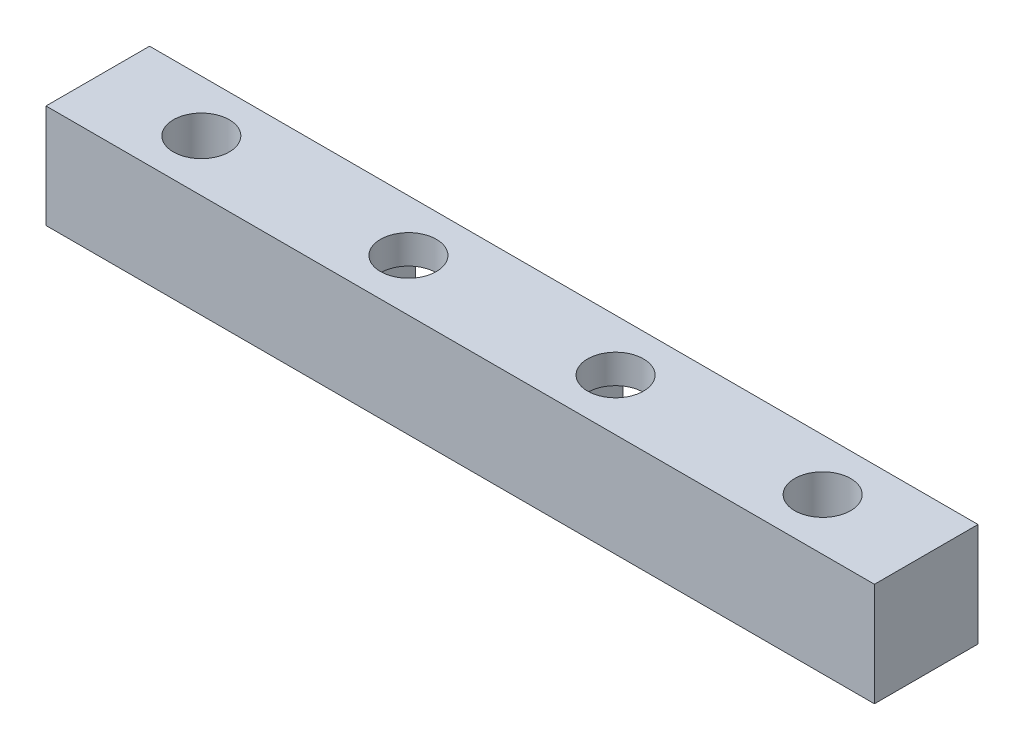
ISO-10303-21;
HEADER;
FILE_DESCRIPTION(('STEP AP214'),'2;1');
FILE_NAME('part.step','',(''),(''),'','','');
FILE_SCHEMA(('AUTOMOTIVE_DESIGN { 1 0 10303 214 1 1 1 1 }'));
ENDSEC;
DATA;
#1=APPLICATION_CONTEXT('core data for automotive mechanical design processes');
#2=APPLICATION_PROTOCOL_DEFINITION('international standard','automotive_design',2000,#1);
#3=PRODUCT_CONTEXT('',#1,'mechanical');
#4=PRODUCT('Part','Part','',(#3));
#5=PRODUCT_RELATED_PRODUCT_CATEGORY('part','',(#4));
#6=PRODUCT_DEFINITION_FORMATION('','',#4);
#7=PRODUCT_DEFINITION_CONTEXT('part definition',#1,'design');
#8=PRODUCT_DEFINITION('design','',#6,#7);
#9=PRODUCT_DEFINITION_SHAPE('','',#8);
#10=(LENGTH_UNIT() NAMED_UNIT(*) SI_UNIT(.MILLI.,.METRE.));
#11=(NAMED_UNIT(*) PLANE_ANGLE_UNIT() SI_UNIT($,.RADIAN.));
#12=(NAMED_UNIT(*) SI_UNIT($,.STERADIAN.) SOLID_ANGLE_UNIT());
#13=UNCERTAINTY_MEASURE_WITH_UNIT(LENGTH_MEASURE(1.E-05),#10,'distance_accuracy_value','');
#14=(GEOMETRIC_REPRESENTATION_CONTEXT(3) GLOBAL_UNCERTAINTY_ASSIGNED_CONTEXT((#13)) GLOBAL_UNIT_ASSIGNED_CONTEXT((#10,
#11,#12)) REPRESENTATION_CONTEXT('',''));
#15=CARTESIAN_POINT('',(0.,0.,0.));
#16=DIRECTION('',(0.,0.,1.));
#17=DIRECTION('',(1.,0.,0.));
#18=AXIS2_PLACEMENT_3D('',#15,#16,#17);
#19=CARTESIAN_POINT('',(-50.8,12.7,-12.7));
#20=DIRECTION('',(0.,0.,1.));
#21=DIRECTION('',(1.,0.,0.));
#22=AXIS2_PLACEMENT_3D('',#19,#20,#21);
#23=PLANE('',#22);
#24=DIRECTION('',(-1.,0.,0.));
#25=VECTOR('',#24,1.);
#26=CARTESIAN_POINT('',(-50.8,3.556,-12.7));
#27=LINE('',#26,#25);
#28=CARTESIAN_POINT('',(-7.23900000000001,3.556,-12.7));
#29=VERTEX_POINT('',#28);
#30=CARTESIAN_POINT('',(-18.161,3.556,-12.7));
#31=VERTEX_POINT('',#30);
#32=EDGE_CURVE('E216',#29,#31,#27,.T.);
#33=ORIENTED_EDGE('',*,*,#32,.F.);
#34=DIRECTION('',(0.,1.,0.));
#35=VECTOR('',#34,1.);
#36=CARTESIAN_POINT('',(-7.23900000000002,12.7,-12.7));
#37=LINE('',#36,#35);
#38=CARTESIAN_POINT('',(-7.23900000000001,9.144,-12.7));
#39=VERTEX_POINT('',#38);
#40=EDGE_CURVE('E272',#29,#39,#37,.T.);
#41=ORIENTED_EDGE('',*,*,#40,.T.);
#42=DIRECTION('',(-1.,0.,0.));
#43=VECTOR('',#42,1.);
#44=CARTESIAN_POINT('',(-50.8,9.144,-12.7));
#45=LINE('',#44,#43);
#46=CARTESIAN_POINT('',(-18.161,9.144,-12.7));
#47=VERTEX_POINT('',#46);
#48=EDGE_CURVE('E212',#39,#47,#45,.T.);
#49=ORIENTED_EDGE('',*,*,#48,.T.);
#50=DIRECTION('',(0.,-1.,0.));
#51=VECTOR('',#50,1.);
#52=CARTESIAN_POINT('',(-18.161,12.7,-12.7));
#53=LINE('',#52,#51);
#54=EDGE_CURVE('E279',#47,#31,#53,.T.);
#55=ORIENTED_EDGE('',*,*,#54,.T.);
#56=EDGE_LOOP('',(#33,#41,#49,#55));
#57=FACE_BOUND('',#56,.T.);
#58=DIRECTION('',(-1.,0.,0.));
#59=VECTOR('',#58,1.);
#60=CARTESIAN_POINT('',(-50.8,0.,-12.7));
#61=LINE('',#60,#59);
#62=CARTESIAN_POINT('',(50.8,0.,-12.7));
#63=VERTEX_POINT('',#62);
#64=CARTESIAN_POINT('',(-50.8,0.,-12.7));
#65=VERTEX_POINT('',#64);
#66=EDGE_CURVE('E247',#63,#65,#61,.T.);
#67=ORIENTED_EDGE('',*,*,#66,.T.);
#68=DIRECTION('',(0.,-1.,0.));
#69=VECTOR('',#68,1.);
#70=CARTESIAN_POINT('',(-50.8,12.7,-12.7));
#71=LINE('',#70,#69);
#72=CARTESIAN_POINT('',(-50.8,12.7,-12.7));
#73=VERTEX_POINT('',#72);
#74=EDGE_CURVE('E253',#73,#65,#71,.T.);
#75=ORIENTED_EDGE('',*,*,#74,.F.);
#76=DIRECTION('',(-1.,0.,0.));
#77=VECTOR('',#76,1.);
#78=CARTESIAN_POINT('',(-50.8,12.7,-12.7));
#79=LINE('',#78,#77);
#80=CARTESIAN_POINT('',(50.8,12.7,-12.7));
#81=VERTEX_POINT('',#80);
#82=EDGE_CURVE('E251',#81,#73,#79,.T.);
#83=ORIENTED_EDGE('',*,*,#82,.F.);
#84=DIRECTION('',(0.,-1.,0.));
#85=VECTOR('',#84,1.);
#86=CARTESIAN_POINT('',(50.8,12.7,-12.7));
#87=LINE('',#86,#85);
#88=EDGE_CURVE('E263',#81,#63,#87,.T.);
#89=ORIENTED_EDGE('',*,*,#88,.T.);
#90=EDGE_LOOP('',(#67,#75,#83,#89));
#91=FACE_BOUND('',#90,.T.);
#92=DIRECTION('',(-1.,0.,0.));
#93=VECTOR('',#92,1.);
#94=CARTESIAN_POINT('',(-50.8,3.556,-12.7));
#95=LINE('',#94,#93);
#96=CARTESIAN_POINT('',(18.161,3.556,-12.7));
#97=VERTEX_POINT('',#96);
#98=CARTESIAN_POINT('',(7.23899999999999,3.556,-12.7));
#99=VERTEX_POINT('',#98);
#100=EDGE_CURVE('E180',#97,#99,#95,.T.);
#101=ORIENTED_EDGE('',*,*,#100,.F.);
#102=DIRECTION('',(0.,1.,0.));
#103=VECTOR('',#102,1.);
#104=CARTESIAN_POINT('',(18.161,12.7,-12.7));
#105=LINE('',#104,#103);
#106=CARTESIAN_POINT('',(18.161,9.144,-12.7));
#107=VERTEX_POINT('',#106);
#108=EDGE_CURVE('E43',#97,#107,#105,.T.);
#109=ORIENTED_EDGE('',*,*,#108,.T.);
#110=DIRECTION('',(-1.,0.,0.));
#111=VECTOR('',#110,1.);
#112=CARTESIAN_POINT('',(-50.8,9.144,-12.7));
#113=LINE('',#112,#111);
#114=CARTESIAN_POINT('',(7.23899999999999,9.144,-12.7));
#115=VERTEX_POINT('',#114);
#116=EDGE_CURVE('E176',#107,#115,#113,.T.);
#117=ORIENTED_EDGE('',*,*,#116,.T.);
#118=DIRECTION('',(0.,-1.,0.));
#119=VECTOR('',#118,1.);
#120=CARTESIAN_POINT('',(7.23899999999999,12.7,-12.7));
#121=LINE('',#120,#119);
#122=EDGE_CURVE('E11',#115,#99,#121,.T.);
#123=ORIENTED_EDGE('',*,*,#122,.T.);
#124=EDGE_LOOP('',(#101,#109,#117,#123));
#125=FACE_BOUND('',#124,.T.);
#126=ADVANCED_FACE('F35',(#57,#91,#125),#23,.F.);
#127=CARTESIAN_POINT('',(12.7,0.,-6.34999999999998));
#128=DIRECTION('',(0.,1.,0.));
#129=DIRECTION('',(0.,0.,1.));
#130=AXIS2_PLACEMENT_3D('',#127,#128,#129);
#131=CYLINDRICAL_SURFACE('',#130,3.429);
#132=CARTESIAN_POINT('',(12.7,0.,-6.34999999999998));
#133=DIRECTION('',(0.,1.,0.));
#134=DIRECTION('',(0.,0.,1.));
#135=AXIS2_PLACEMENT_3D('',#132,#133,#134);
#136=CIRCLE('',#135,3.429);
#137=CARTESIAN_POINT('',(12.7,0.,-2.92099999999998));
#138=VERTEX_POINT('',#137);
#139=EDGE_CURVE('E232',#138,#138,#136,.T.);
#140=ORIENTED_EDGE('',*,*,#139,.F.);
#141=EDGE_LOOP('',(#140));
#142=FACE_BOUND('',#141,.T.);
#143=CARTESIAN_POINT('',(12.7,3.556,-6.34999999999998));
#144=DIRECTION('',(0.,1.,0.));
#145=DIRECTION('',(0.,0.,1.));
#146=AXIS2_PLACEMENT_3D('',#143,#144,#145);
#147=CIRCLE('',#146,3.429);
#148=CARTESIAN_POINT('',(12.7,3.556,-2.92099999999998));
#149=VERTEX_POINT('',#148);
#150=EDGE_CURVE('E179',#149,#149,#147,.F.);
#151=ORIENTED_EDGE('',*,*,#150,.F.);
#152=EDGE_LOOP('',(#151));
#153=FACE_BOUND('',#152,.T.);
#154=ADVANCED_FACE('F306',(#142,#153),#131,.F.);
#155=CARTESIAN_POINT('',(-12.7,0.,-6.34999999999998));
#156=DIRECTION('',(0.,1.,0.));
#157=DIRECTION('',(0.,0.,1.));
#158=AXIS2_PLACEMENT_3D('',#155,#156,#157);
#159=CYLINDRICAL_SURFACE('',#158,3.429);
#160=CARTESIAN_POINT('',(-12.7,0.,-6.34999999999998));
#161=DIRECTION('',(0.,1.,0.));
#162=DIRECTION('',(0.,0.,1.));
#163=AXIS2_PLACEMENT_3D('',#160,#161,#162);
#164=CIRCLE('',#163,3.429);
#165=CARTESIAN_POINT('',(-12.7,0.,-2.92099999999998));
#166=VERTEX_POINT('',#165);
#167=EDGE_CURVE('E226',#166,#166,#164,.T.);
#168=ORIENTED_EDGE('',*,*,#167,.F.);
#169=EDGE_LOOP('',(#168));
#170=FACE_BOUND('',#169,.T.);
#171=CARTESIAN_POINT('',(-12.7,3.556,-6.34999999999998));
#172=DIRECTION('',(0.,1.,0.));
#173=DIRECTION('',(0.,0.,1.));
#174=AXIS2_PLACEMENT_3D('',#171,#172,#173);
#175=CIRCLE('',#174,3.429);
#176=CARTESIAN_POINT('',(-12.7,3.556,-2.92099999999998));
#177=VERTEX_POINT('',#176);
#178=EDGE_CURVE('E215',#177,#177,#175,.F.);
#179=ORIENTED_EDGE('',*,*,#178,.F.);
#180=EDGE_LOOP('',(#179));
#181=FACE_BOUND('',#180,.T.);
#182=ADVANCED_FACE('F312',(#170,#181),#159,.F.);
#183=CARTESIAN_POINT('',(-50.8,12.7,-12.7));
#184=DIRECTION('',(1.,0.,0.));
#185=DIRECTION('',(0.,0.,-1.));
#186=AXIS2_PLACEMENT_3D('',#183,#184,#185);
#187=PLANE('',#186);
#188=DIRECTION('',(0.,0.,1.));
#189=VECTOR('',#188,1.);
#190=CARTESIAN_POINT('',(-50.8,0.,-12.7));
#191=LINE('',#190,#189);
#192=CARTESIAN_POINT('',(-50.8,0.,0.));
#193=VERTEX_POINT('',#192);
#194=EDGE_CURVE('E240',#65,#193,#191,.T.);
#195=ORIENTED_EDGE('',*,*,#194,.T.);
#196=DIRECTION('',(0.,-1.,0.));
#197=VECTOR('',#196,1.);
#198=CARTESIAN_POINT('',(-50.8,12.7,0.));
#199=LINE('',#198,#197);
#200=CARTESIAN_POINT('',(-50.8,12.7,0.));
#201=VERTEX_POINT('',#200);
#202=EDGE_CURVE('E269',#201,#193,#199,.T.);
#203=ORIENTED_EDGE('',*,*,#202,.F.);
#204=DIRECTION('',(0.,0.,1.));
#205=VECTOR('',#204,1.);
#206=CARTESIAN_POINT('',(-50.8,12.7,-12.7));
#207=LINE('',#206,#205);
#208=EDGE_CURVE('E243',#73,#201,#207,.T.);
#209=ORIENTED_EDGE('',*,*,#208,.F.);
#210=ORIENTED_EDGE('',*,*,#74,.T.);
#211=EDGE_LOOP('',(#195,#203,#209,#210));
#212=FACE_BOUND('',#211,.T.);
#213=ADVANCED_FACE('F37',(#212),#187,.F.);
#214=CARTESIAN_POINT('',(-50.8,12.7,0.));
#215=DIRECTION('',(0.,0.,-1.));
#216=DIRECTION('',(-1.,0.,0.));
#217=AXIS2_PLACEMENT_3D('',#214,#215,#216);
#218=PLANE('',#217);
#219=DIRECTION('',(1.,0.,0.));
#220=VECTOR('',#219,1.);
#221=CARTESIAN_POINT('',(-50.8,0.,0.));
#222=LINE('',#221,#220);
#223=CARTESIAN_POINT('',(50.8,0.,0.));
#224=VERTEX_POINT('',#223);
#225=EDGE_CURVE('E256',#193,#224,#222,.T.);
#226=ORIENTED_EDGE('',*,*,#225,.T.);
#227=DIRECTION('',(0.,-1.,0.));
#228=VECTOR('',#227,1.);
#229=CARTESIAN_POINT('',(50.8,12.7,0.));
#230=LINE('',#229,#228);
#231=CARTESIAN_POINT('',(50.8,12.7,0.));
#232=VERTEX_POINT('',#231);
#233=EDGE_CURVE('E266',#232,#224,#230,.T.);
#234=ORIENTED_EDGE('',*,*,#233,.F.);
#235=DIRECTION('',(1.,0.,0.));
#236=VECTOR('',#235,1.);
#237=CARTESIAN_POINT('',(-50.8,12.7,0.));
#238=LINE('',#237,#236);
#239=EDGE_CURVE('E246',#201,#232,#238,.T.);
#240=ORIENTED_EDGE('',*,*,#239,.F.);
#241=ORIENTED_EDGE('',*,*,#202,.T.);
#242=EDGE_LOOP('',(#226,#234,#240,#241));
#243=FACE_BOUND('',#242,.T.);
#244=ADVANCED_FACE('F325',(#243),#218,.F.);
#245=CARTESIAN_POINT('',(50.8,12.7,-12.7));
#246=DIRECTION('',(-1.,0.,0.));
#247=DIRECTION('',(0.,0.,1.));
#248=AXIS2_PLACEMENT_3D('',#245,#246,#247);
#249=PLANE('',#248);
#250=DIRECTION('',(0.,0.,-1.));
#251=VECTOR('',#250,1.);
#252=CARTESIAN_POINT('',(50.8,0.,-12.7));
#253=LINE('',#252,#251);
#254=EDGE_CURVE('E258',#224,#63,#253,.T.);
#255=ORIENTED_EDGE('',*,*,#254,.T.);
#256=ORIENTED_EDGE('',*,*,#88,.F.);
#257=DIRECTION('',(0.,0.,-1.));
#258=VECTOR('',#257,1.);
#259=CARTESIAN_POINT('',(50.8,12.7,-12.7));
#260=LINE('',#259,#258);
#261=EDGE_CURVE('E249',#232,#81,#260,.T.);
#262=ORIENTED_EDGE('',*,*,#261,.F.);
#263=ORIENTED_EDGE('',*,*,#233,.T.);
#264=EDGE_LOOP('',(#255,#256,#262,#263));
#265=FACE_BOUND('',#264,.T.);
#266=ADVANCED_FACE('F322',(#265),#249,.F.);
#267=CARTESIAN_POINT('',(0.,12.7,0.));
#268=DIRECTION('',(0.,1.,0.));
#269=DIRECTION('',(0.,0.,1.));
#270=AXIS2_PLACEMENT_3D('',#267,#268,#269);
#271=PLANE('',#270);
#272=CARTESIAN_POINT('',(38.1,12.7,-6.34999999999998));
#273=DIRECTION('',(0.,1.,0.));
#274=DIRECTION('',(0.,0.,1.));
#275=AXIS2_PLACEMENT_3D('',#272,#273,#274);
#276=CIRCLE('',#275,3.429);
#277=CARTESIAN_POINT('',(38.1,12.7,-2.92099999999998));
#278=VERTEX_POINT('',#277);
#279=EDGE_CURVE('E223',#278,#278,#276,.T.);
#280=ORIENTED_EDGE('',*,*,#279,.F.);
#281=EDGE_LOOP('',(#280));
#282=FACE_BOUND('',#281,.T.);
#283=CARTESIAN_POINT('',(-12.7,12.7,-6.34999999999998));
#284=DIRECTION('',(0.,1.,0.));
#285=DIRECTION('',(0.,0.,1.));
#286=AXIS2_PLACEMENT_3D('',#283,#284,#285);
#287=CIRCLE('',#286,3.429);
#288=CARTESIAN_POINT('',(-12.7,12.7,-2.92099999999998));
#289=VERTEX_POINT('',#288);
#290=EDGE_CURVE('E229',#289,#289,#287,.T.);
#291=ORIENTED_EDGE('',*,*,#290,.F.);
#292=EDGE_LOOP('',(#291));
#293=FACE_BOUND('',#292,.T.);
#294=CARTESIAN_POINT('',(12.7,12.7,-6.34999999999998));
#295=DIRECTION('',(0.,1.,0.));
#296=DIRECTION('',(0.,0.,1.));
#297=AXIS2_PLACEMENT_3D('',#294,#295,#296);
#298=CIRCLE('',#297,3.429);
#299=CARTESIAN_POINT('',(12.7,12.7,-2.92099999999998));
#300=VERTEX_POINT('',#299);
#301=EDGE_CURVE('E218',#300,#300,#298,.T.);
#302=ORIENTED_EDGE('',*,*,#301,.F.);
#303=EDGE_LOOP('',(#302));
#304=FACE_BOUND('',#303,.T.);
#305=CARTESIAN_POINT('',(-38.1,12.7,-6.34999999999998));
#306=DIRECTION('',(0.,1.,0.));
#307=DIRECTION('',(0.,0.,1.));
#308=AXIS2_PLACEMENT_3D('',#305,#306,#307);
#309=CIRCLE('',#308,3.429);
#310=CARTESIAN_POINT('',(-38.1,12.7,-2.92099999999998));
#311=VERTEX_POINT('',#310);
#312=EDGE_CURVE('E222',#311,#311,#309,.T.);
#313=ORIENTED_EDGE('',*,*,#312,.F.);
#314=EDGE_LOOP('',(#313));
#315=FACE_BOUND('',#314,.T.);
#316=ORIENTED_EDGE('',*,*,#208,.T.);
#317=ORIENTED_EDGE('',*,*,#239,.T.);
#318=ORIENTED_EDGE('',*,*,#261,.T.);
#319=ORIENTED_EDGE('',*,*,#82,.T.);
#320=EDGE_LOOP('',(#316,#317,#318,#319));
#321=FACE_BOUND('',#320,.T.);
#322=ADVANCED_FACE('F324',(#282,#293,#304,#315,#321),#271,.T.);
#323=CARTESIAN_POINT('',(0.,0.,0.));
#324=DIRECTION('',(0.,1.,0.));
#325=DIRECTION('',(0.,0.,1.));
#326=AXIS2_PLACEMENT_3D('',#323,#324,#325);
#327=PLANE('',#326);
#328=CARTESIAN_POINT('',(38.1,0.,-6.34999999999998));
#329=DIRECTION('',(0.,1.,0.));
#330=DIRECTION('',(0.,0.,1.));
#331=AXIS2_PLACEMENT_3D('',#328,#329,#330);
#332=CIRCLE('',#331,3.429);
#333=CARTESIAN_POINT('',(38.1,0.,-2.92099999999998));
#334=VERTEX_POINT('',#333);
#335=EDGE_CURVE('E219',#334,#334,#332,.T.);
#336=ORIENTED_EDGE('',*,*,#335,.T.);
#337=EDGE_LOOP('',(#336));
#338=FACE_BOUND('',#337,.T.);
#339=ORIENTED_EDGE('',*,*,#167,.T.);
#340=EDGE_LOOP('',(#339));
#341=FACE_BOUND('',#340,.T.);
#342=ORIENTED_EDGE('',*,*,#139,.T.);
#343=EDGE_LOOP('',(#342));
#344=FACE_BOUND('',#343,.T.);
#345=CARTESIAN_POINT('',(-38.1,0.,-6.34999999999998));
#346=DIRECTION('',(0.,1.,0.));
#347=DIRECTION('',(0.,0.,1.));
#348=AXIS2_PLACEMENT_3D('',#345,#346,#347);
#349=CIRCLE('',#348,3.429);
#350=CARTESIAN_POINT('',(-38.1,0.,-2.92099999999998));
#351=VERTEX_POINT('',#350);
#352=EDGE_CURVE('E237',#351,#351,#349,.T.);
#353=ORIENTED_EDGE('',*,*,#352,.T.);
#354=EDGE_LOOP('',(#353));
#355=FACE_BOUND('',#354,.T.);
#356=ORIENTED_EDGE('',*,*,#194,.F.);
#357=ORIENTED_EDGE('',*,*,#66,.F.);
#358=ORIENTED_EDGE('',*,*,#254,.F.);
#359=ORIENTED_EDGE('',*,*,#225,.F.);
#360=EDGE_LOOP('',(#356,#357,#358,#359));
#361=FACE_BOUND('',#360,.T.);
#362=ADVANCED_FACE('F320',(#338,#341,#344,#355,#361),#327,.F.);
#363=CARTESIAN_POINT('',(-38.1,0.,-6.34999999999998));
#364=DIRECTION('',(0.,1.,0.));
#365=DIRECTION('',(0.,0.,1.));
#366=AXIS2_PLACEMENT_3D('',#363,#364,#365);
#367=CYLINDRICAL_SURFACE('',#366,3.429);
#368=ORIENTED_EDGE('',*,*,#352,.F.);
#369=EDGE_LOOP('',(#368));
#370=FACE_BOUND('',#369,.T.);
#371=ORIENTED_EDGE('',*,*,#312,.T.);
#372=EDGE_LOOP('',(#371));
#373=FACE_BOUND('',#372,.T.);
#374=ADVANCED_FACE('F350',(#370,#373),#367,.F.);
#375=CARTESIAN_POINT('',(12.7,9.144,-6.34999999999998));
#376=DIRECTION('',(0.,1.,0.));
#377=DIRECTION('',(0.,0.,1.));
#378=AXIS2_PLACEMENT_3D('',#375,#376,#377);
#379=CIRCLE('',#378,3.429);
#380=CARTESIAN_POINT('',(12.7,9.144,-2.92099999999998));
#381=VERTEX_POINT('',#380);
#382=EDGE_CURVE('E174',#381,#381,#379,.F.);
#383=ORIENTED_EDGE('',*,*,#382,.T.);
#384=EDGE_LOOP('',(#383));
#385=FACE_BOUND('',#384,.T.);
#386=ORIENTED_EDGE('',*,*,#301,.T.);
#387=EDGE_LOOP('',(#386));
#388=FACE_BOUND('',#387,.T.);
#389=ADVANCED_FACE('F315',(#385,#388),#131,.F.);
#390=CARTESIAN_POINT('',(-12.7,9.144,-6.34999999999998));
#391=DIRECTION('',(0.,1.,0.));
#392=DIRECTION('',(0.,0.,1.));
#393=AXIS2_PLACEMENT_3D('',#390,#391,#392);
#394=CIRCLE('',#393,3.429);
#395=CARTESIAN_POINT('',(-12.7,9.144,-2.92099999999998));
#396=VERTEX_POINT('',#395);
#397=EDGE_CURVE('E207',#396,#396,#394,.F.);
#398=ORIENTED_EDGE('',*,*,#397,.T.);
#399=EDGE_LOOP('',(#398));
#400=FACE_BOUND('',#399,.T.);
#401=ORIENTED_EDGE('',*,*,#290,.T.);
#402=EDGE_LOOP('',(#401));
#403=FACE_BOUND('',#402,.T.);
#404=ADVANCED_FACE('F359',(#400,#403),#159,.F.);
#405=CARTESIAN_POINT('',(38.1,0.,-6.34999999999998));
#406=DIRECTION('',(0.,1.,0.));
#407=DIRECTION('',(0.,0.,1.));
#408=AXIS2_PLACEMENT_3D('',#405,#406,#407);
#409=CYLINDRICAL_SURFACE('',#408,3.429);
#410=ORIENTED_EDGE('',*,*,#335,.F.);
#411=EDGE_LOOP('',(#410));
#412=FACE_BOUND('',#411,.T.);
#413=ORIENTED_EDGE('',*,*,#279,.T.);
#414=EDGE_LOOP('',(#413));
#415=FACE_BOUND('',#414,.T.);
#416=ADVANCED_FACE('F363',(#412,#415),#409,.F.);
#417=CARTESIAN_POINT('',(-18.161,3.556,-3.19709017995544));
#418=DIRECTION('',(-1.,0.,0.));
#419=DIRECTION('',(0.,0.,1.));
#420=AXIS2_PLACEMENT_3D('',#417,#418,#419);
#421=PLANE('',#420);
#422=DIRECTION('',(0.,0.,1.));
#423=VECTOR('',#422,1.);
#424=CARTESIAN_POINT('',(-18.161,9.144,-3.19709017995544));
#425=LINE('',#424,#423);
#426=CARTESIAN_POINT('',(-18.161,9.144,-3.19709017995544));
#427=VERTEX_POINT('',#426);
#428=EDGE_CURVE('E58',#47,#427,#425,.T.);
#429=ORIENTED_EDGE('',*,*,#428,.T.);
#430=DIRECTION('',(0.,1.,0.));
#431=VECTOR('',#430,1.);
#432=CARTESIAN_POINT('',(-18.161,3.556,-3.19709017995544));
#433=LINE('',#432,#431);
#434=CARTESIAN_POINT('',(-18.161,3.556,-3.19709017995544));
#435=VERTEX_POINT('',#434);
#436=EDGE_CURVE('E204',#435,#427,#433,.T.);
#437=ORIENTED_EDGE('',*,*,#436,.F.);
#438=DIRECTION('',(0.,0.,1.));
#439=VECTOR('',#438,1.);
#440=CARTESIAN_POINT('',(-18.161,3.556,-3.19709017995544));
#441=LINE('',#440,#439);
#442=EDGE_CURVE('E192',#31,#435,#441,.T.);
#443=ORIENTED_EDGE('',*,*,#442,.F.);
#444=ORIENTED_EDGE('',*,*,#54,.F.);
#445=EDGE_LOOP('',(#429,#437,#443,#444));
#446=FACE_BOUND('',#445,.T.);
#447=ADVANCED_FACE('F367',(#446),#421,.F.);
#448=CARTESIAN_POINT('',(-7.23900000000001,3.556,-19.396139052979));
#449=DIRECTION('',(1.,0.,0.));
#450=DIRECTION('',(0.,0.,-1.));
#451=AXIS2_PLACEMENT_3D('',#448,#449,#450);
#452=PLANE('',#451);
#453=DIRECTION('',(0.,0.,-1.));
#454=VECTOR('',#453,1.);
#455=CARTESIAN_POINT('',(-7.23900000000001,3.556,-3.19709017995543));
#456=LINE('',#455,#454);
#457=CARTESIAN_POINT('',(-7.23900000000001,3.556,-3.19709017995543));
#458=VERTEX_POINT('',#457);
#459=EDGE_CURVE('E189',#458,#29,#456,.T.);
#460=ORIENTED_EDGE('',*,*,#459,.F.);
#461=DIRECTION('',(0.,1.,0.));
#462=VECTOR('',#461,1.);
#463=CARTESIAN_POINT('',(-7.23900000000001,3.556,-3.19709017995543));
#464=LINE('',#463,#462);
#465=CARTESIAN_POINT('',(-7.23900000000001,9.144,-3.19709017995543));
#466=VERTEX_POINT('',#465);
#467=EDGE_CURVE('E208',#458,#466,#464,.T.);
#468=ORIENTED_EDGE('',*,*,#467,.T.);
#469=DIRECTION('',(0.,0.,-1.));
#470=VECTOR('',#469,1.);
#471=CARTESIAN_POINT('',(-7.23900000000001,9.144,-19.396139052979));
#472=LINE('',#471,#470);
#473=EDGE_CURVE('E200',#466,#39,#472,.T.);
#474=ORIENTED_EDGE('',*,*,#473,.T.);
#475=ORIENTED_EDGE('',*,*,#40,.F.);
#476=EDGE_LOOP('',(#460,#468,#474,#475));
#477=FACE_BOUND('',#476,.T.);
#478=ADVANCED_FACE('F378',(#477),#452,.F.);
#479=CARTESIAN_POINT('',(0.,3.556,0.));
#480=DIRECTION('',(0.,1.,0.));
#481=DIRECTION('',(0.,0.,1.));
#482=AXIS2_PLACEMENT_3D('',#479,#480,#481);
#483=PLANE('',#482);
#484=ORIENTED_EDGE('',*,*,#178,.T.);
#485=EDGE_LOOP('',(#484));
#486=FACE_BOUND('',#485,.T.);
#487=ORIENTED_EDGE('',*,*,#32,.T.);
#488=ORIENTED_EDGE('',*,*,#442,.T.);
#489=DIRECTION('',(0.866025403784439,0.,0.5));
#490=VECTOR('',#489,1.);
#491=CARTESIAN_POINT('',(-18.161,3.556,-3.19709017995544));
#492=LINE('',#491,#490);
#493=CARTESIAN_POINT('',(-12.7,3.556,-0.0441803599108889));
#494=VERTEX_POINT('',#493);
#495=EDGE_CURVE('E183',#435,#494,#492,.T.);
#496=ORIENTED_EDGE('',*,*,#495,.T.);
#497=DIRECTION('',(0.866025403784439,0.,-0.5));
#498=VECTOR('',#497,1.);
#499=CARTESIAN_POINT('',(-12.7,3.556,-0.0441803599108889));
#500=LINE('',#499,#498);
#501=EDGE_CURVE('E186',#494,#458,#500,.T.);
#502=ORIENTED_EDGE('',*,*,#501,.T.);
#503=ORIENTED_EDGE('',*,*,#459,.T.);
#504=EDGE_LOOP('',(#487,#488,#496,#502,#503));
#505=FACE_BOUND('',#504,.T.);
#506=ADVANCED_FACE('F381',(#486,#505),#483,.T.);
#507=CARTESIAN_POINT('',(0.,9.144,0.));
#508=DIRECTION('',(0.,1.,0.));
#509=DIRECTION('',(0.,0.,1.));
#510=AXIS2_PLACEMENT_3D('',#507,#508,#509);
#511=PLANE('',#510);
#512=ORIENTED_EDGE('',*,*,#397,.F.);
#513=EDGE_LOOP('',(#512));
#514=FACE_BOUND('',#513,.T.);
#515=ORIENTED_EDGE('',*,*,#473,.F.);
#516=DIRECTION('',(0.866025403784439,0.,-0.5));
#517=VECTOR('',#516,1.);
#518=CARTESIAN_POINT('',(-12.7,9.144,-0.0441803599108889));
#519=LINE('',#518,#517);
#520=CARTESIAN_POINT('',(-12.7,9.144,-0.0441803599108889));
#521=VERTEX_POINT('',#520);
#522=EDGE_CURVE('E197',#521,#466,#519,.T.);
#523=ORIENTED_EDGE('',*,*,#522,.F.);
#524=DIRECTION('',(0.866025403784439,0.,0.5));
#525=VECTOR('',#524,1.);
#526=CARTESIAN_POINT('',(-18.161,9.144,-3.19709017995544));
#527=LINE('',#526,#525);
#528=EDGE_CURVE('E182',#427,#521,#527,.T.);
#529=ORIENTED_EDGE('',*,*,#528,.F.);
#530=ORIENTED_EDGE('',*,*,#428,.F.);
#531=ORIENTED_EDGE('',*,*,#48,.F.);
#532=EDGE_LOOP('',(#515,#523,#529,#530,#531));
#533=FACE_BOUND('',#532,.T.);
#534=ADVANCED_FACE('F373',(#514,#533),#511,.F.);
#535=CARTESIAN_POINT('',(-18.161,3.556,-3.19709017995544));
#536=DIRECTION('',(-0.5,0.,0.866025403784439));
#537=DIRECTION('',(0.866025403784438,0.,0.5));
#538=AXIS2_PLACEMENT_3D('',#535,#536,#537);
#539=PLANE('',#538);
#540=ORIENTED_EDGE('',*,*,#528,.T.);
#541=DIRECTION('',(0.,1.,0.));
#542=VECTOR('',#541,1.);
#543=CARTESIAN_POINT('',(-12.7,3.556,-0.0441803599108889));
#544=LINE('',#543,#542);
#545=EDGE_CURVE('E194',#494,#521,#544,.T.);
#546=ORIENTED_EDGE('',*,*,#545,.F.);
#547=ORIENTED_EDGE('',*,*,#495,.F.);
#548=ORIENTED_EDGE('',*,*,#436,.T.);
#549=EDGE_LOOP('',(#540,#546,#547,#548));
#550=FACE_BOUND('',#549,.T.);
#551=ADVANCED_FACE('F369',(#550),#539,.F.);
#552=CARTESIAN_POINT('',(-12.7,3.556,-0.0441803599108889));
#553=DIRECTION('',(0.5,0.,0.866025403784439));
#554=DIRECTION('',(0.866025403784439,0.,-0.5));
#555=AXIS2_PLACEMENT_3D('',#552,#553,#554);
#556=PLANE('',#555);
#557=ORIENTED_EDGE('',*,*,#522,.T.);
#558=ORIENTED_EDGE('',*,*,#467,.F.);
#559=ORIENTED_EDGE('',*,*,#501,.F.);
#560=ORIENTED_EDGE('',*,*,#545,.T.);
#561=EDGE_LOOP('',(#557,#558,#559,#560));
#562=FACE_BOUND('',#561,.T.);
#563=ADVANCED_FACE('F372',(#562),#556,.F.);
#564=CARTESIAN_POINT('',(7.23899999999999,3.556,-3.19709017995544));
#565=DIRECTION('',(-1.,0.,0.));
#566=DIRECTION('',(0.,0.,1.));
#567=AXIS2_PLACEMENT_3D('',#564,#565,#566);
#568=PLANE('',#567);
#569=DIRECTION('',(0.,0.,1.));
#570=VECTOR('',#569,1.);
#571=CARTESIAN_POINT('',(7.23899999999999,9.144,-3.19709017995544));
#572=LINE('',#571,#570);
#573=CARTESIAN_POINT('',(7.23899999999999,9.144,-3.19709017995544));
#574=VERTEX_POINT('',#573);
#575=EDGE_CURVE('E50',#115,#574,#572,.T.);
#576=ORIENTED_EDGE('',*,*,#575,.T.);
#577=DIRECTION('',(0.,1.,0.));
#578=VECTOR('',#577,1.);
#579=CARTESIAN_POINT('',(7.23899999999999,3.556,-3.19709017995544));
#580=LINE('',#579,#578);
#581=CARTESIAN_POINT('',(7.23899999999999,3.556,-3.19709017995544));
#582=VERTEX_POINT('',#581);
#583=EDGE_CURVE('E172',#582,#574,#580,.T.);
#584=ORIENTED_EDGE('',*,*,#583,.F.);
#585=DIRECTION('',(0.,0.,1.));
#586=VECTOR('',#585,1.);
#587=CARTESIAN_POINT('',(7.23899999999999,3.556,-3.19709017995544));
#588=LINE('',#587,#586);
#589=EDGE_CURVE('E147',#99,#582,#588,.T.);
#590=ORIENTED_EDGE('',*,*,#589,.F.);
#591=ORIENTED_EDGE('',*,*,#122,.F.);
#592=EDGE_LOOP('',(#576,#584,#590,#591));
#593=FACE_BOUND('',#592,.T.);
#594=ADVANCED_FACE('F291',(#593),#568,.F.);
#595=CARTESIAN_POINT('',(18.161,3.556,-19.396139052979));
#596=DIRECTION('',(1.,0.,0.));
#597=DIRECTION('',(0.,0.,-1.));
#598=AXIS2_PLACEMENT_3D('',#595,#596,#597);
#599=PLANE('',#598);
#600=DIRECTION('',(0.,0.,-1.));
#601=VECTOR('',#600,1.);
#602=CARTESIAN_POINT('',(18.161,3.556,-3.19709017995543));
#603=LINE('',#602,#601);
#604=CARTESIAN_POINT('',(18.161,3.556,-3.19709017995543));
#605=VERTEX_POINT('',#604);
#606=EDGE_CURVE('E156',#605,#97,#603,.T.);
#607=ORIENTED_EDGE('',*,*,#606,.F.);
#608=DIRECTION('',(0.,1.,0.));
#609=VECTOR('',#608,1.);
#610=CARTESIAN_POINT('',(18.161,3.556,-3.19709017995543));
#611=LINE('',#610,#609);
#612=CARTESIAN_POINT('',(18.161,9.144,-3.19709017995543));
#613=VERTEX_POINT('',#612);
#614=EDGE_CURVE('E146',#605,#613,#611,.T.);
#615=ORIENTED_EDGE('',*,*,#614,.T.);
#616=DIRECTION('',(0.,0.,-1.));
#617=VECTOR('',#616,1.);
#618=CARTESIAN_POINT('',(18.161,9.144,-19.396139052979));
#619=LINE('',#618,#617);
#620=EDGE_CURVE('E162',#613,#107,#619,.T.);
#621=ORIENTED_EDGE('',*,*,#620,.T.);
#622=ORIENTED_EDGE('',*,*,#108,.F.);
#623=EDGE_LOOP('',(#607,#615,#621,#622));
#624=FACE_BOUND('',#623,.T.);
#625=ADVANCED_FACE('F289',(#624),#599,.F.);
#626=CARTESIAN_POINT('',(0.,3.556,0.));
#627=DIRECTION('',(0.,1.,0.));
#628=DIRECTION('',(0.,0.,1.));
#629=AXIS2_PLACEMENT_3D('',#626,#627,#628);
#630=PLANE('',#629);
#631=ORIENTED_EDGE('',*,*,#150,.T.);
#632=EDGE_LOOP('',(#631));
#633=FACE_BOUND('',#632,.T.);
#634=ORIENTED_EDGE('',*,*,#100,.T.);
#635=ORIENTED_EDGE('',*,*,#589,.T.);
#636=DIRECTION('',(0.866025403784439,0.,0.5));
#637=VECTOR('',#636,1.);
#638=CARTESIAN_POINT('',(7.23899999999999,3.556,-3.19709017995544));
#639=LINE('',#638,#637);
#640=CARTESIAN_POINT('',(12.7,3.556,-0.0441803599108889));
#641=VERTEX_POINT('',#640);
#642=EDGE_CURVE('E141',#582,#641,#639,.T.);
#643=ORIENTED_EDGE('',*,*,#642,.T.);
#644=DIRECTION('',(0.866025403784439,0.,-0.5));
#645=VECTOR('',#644,1.);
#646=CARTESIAN_POINT('',(12.7,3.556,-0.0441803599108889));
#647=LINE('',#646,#645);
#648=EDGE_CURVE('E150',#641,#605,#647,.T.);
#649=ORIENTED_EDGE('',*,*,#648,.T.);
#650=ORIENTED_EDGE('',*,*,#606,.T.);
#651=EDGE_LOOP('',(#634,#635,#643,#649,#650));
#652=FACE_BOUND('',#651,.T.);
#653=ADVANCED_FACE('F158',(#633,#652),#630,.T.);
#654=CARTESIAN_POINT('',(0.,9.144,0.));
#655=DIRECTION('',(0.,1.,0.));
#656=DIRECTION('',(0.,0.,1.));
#657=AXIS2_PLACEMENT_3D('',#654,#655,#656);
#658=PLANE('',#657);
#659=ORIENTED_EDGE('',*,*,#382,.F.);
#660=EDGE_LOOP('',(#659));
#661=FACE_BOUND('',#660,.T.);
#662=ORIENTED_EDGE('',*,*,#620,.F.);
#663=DIRECTION('',(0.866025403784439,0.,-0.5));
#664=VECTOR('',#663,1.);
#665=CARTESIAN_POINT('',(12.7,9.144,-0.0441803599108889));
#666=LINE('',#665,#664);
#667=CARTESIAN_POINT('',(12.7,9.144,-0.0441803599108889));
#668=VERTEX_POINT('',#667);
#669=EDGE_CURVE('E168',#668,#613,#666,.T.);
#670=ORIENTED_EDGE('',*,*,#669,.F.);
#671=DIRECTION('',(0.866025403784439,0.,0.5));
#672=VECTOR('',#671,1.);
#673=CARTESIAN_POINT('',(7.23899999999999,9.144,-3.19709017995544));
#674=LINE('',#673,#672);
#675=EDGE_CURVE('E142',#574,#668,#674,.T.);
#676=ORIENTED_EDGE('',*,*,#675,.F.);
#677=ORIENTED_EDGE('',*,*,#575,.F.);
#678=ORIENTED_EDGE('',*,*,#116,.F.);
#679=EDGE_LOOP('',(#662,#670,#676,#677,#678));
#680=FACE_BOUND('',#679,.T.);
#681=ADVANCED_FACE('F292',(#661,#680),#658,.F.);
#682=CARTESIAN_POINT('',(7.23899999999999,3.556,-3.19709017995544));
#683=DIRECTION('',(-0.5,0.,0.866025403784439));
#684=DIRECTION('',(0.866025403784438,0.,0.5));
#685=AXIS2_PLACEMENT_3D('',#682,#683,#684);
#686=PLANE('',#685);
#687=ORIENTED_EDGE('',*,*,#675,.T.);
#688=DIRECTION('',(0.,1.,0.));
#689=VECTOR('',#688,1.);
#690=CARTESIAN_POINT('',(12.7,3.556,-0.0441803599108889));
#691=LINE('',#690,#689);
#692=EDGE_CURVE('E136',#641,#668,#691,.T.);
#693=ORIENTED_EDGE('',*,*,#692,.F.);
#694=ORIENTED_EDGE('',*,*,#642,.F.);
#695=ORIENTED_EDGE('',*,*,#583,.T.);
#696=EDGE_LOOP('',(#687,#693,#694,#695));
#697=FACE_BOUND('',#696,.T.);
#698=ADVANCED_FACE('F138',(#697),#686,.F.);
#699=CARTESIAN_POINT('',(12.7,3.556,-0.0441803599108889));
#700=DIRECTION('',(0.5,0.,0.866025403784439));
#701=DIRECTION('',(0.866025403784439,0.,-0.5));
#702=AXIS2_PLACEMENT_3D('',#699,#700,#701);
#703=PLANE('',#702);
#704=ORIENTED_EDGE('',*,*,#669,.T.);
#705=ORIENTED_EDGE('',*,*,#614,.F.);
#706=ORIENTED_EDGE('',*,*,#648,.F.);
#707=ORIENTED_EDGE('',*,*,#692,.T.);
#708=EDGE_LOOP('',(#704,#705,#706,#707));
#709=FACE_BOUND('',#708,.T.);
#710=ADVANCED_FACE('F151',(#709),#703,.F.);
#711=CLOSED_SHELL('',(#126,#154,#182,#213,#244,#266,#322,#362,#374,#389,#404,#416,#447,#478,
#506,#534,#551,#563,#594,#625,#653,#681,#698,#710));
#712=MANIFOLD_SOLID_BREP('B2',#711);
#713=ADVANCED_BREP_SHAPE_REPRESENTATION('',(#18,#712),#14);
#714=SHAPE_DEFINITION_REPRESENTATION(#9,#713);
ENDSEC;
END-ISO-10303-21;
